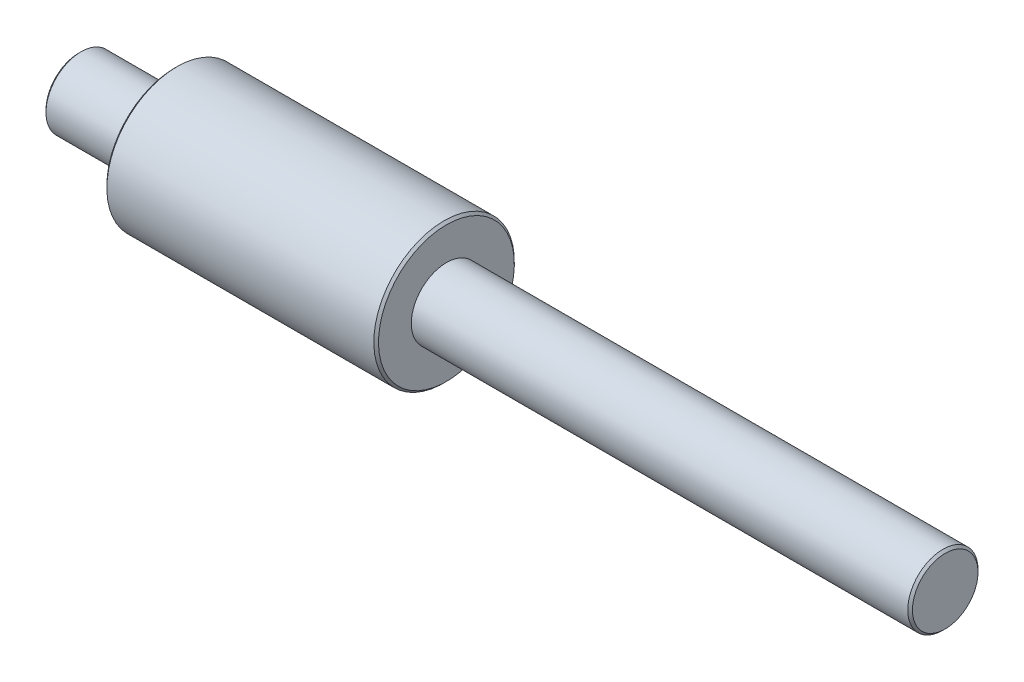
ISO-10303-21;
HEADER;
FILE_DESCRIPTION(('STEP AP214'),'2;1');
FILE_NAME('part.step','',(''),(''),'','','');
FILE_SCHEMA(('AUTOMOTIVE_DESIGN { 1 0 10303 214 1 1 1 1 }'));
ENDSEC;
DATA;
#1=APPLICATION_CONTEXT('core data for automotive mechanical design processes');
#2=APPLICATION_PROTOCOL_DEFINITION('international standard','automotive_design',2000,#1);
#3=PRODUCT_CONTEXT('',#1,'mechanical');
#4=PRODUCT('Part','Part','',(#3));
#5=PRODUCT_RELATED_PRODUCT_CATEGORY('part','',(#4));
#6=PRODUCT_DEFINITION_FORMATION('','',#4);
#7=PRODUCT_DEFINITION_CONTEXT('part definition',#1,'design');
#8=PRODUCT_DEFINITION('design','',#6,#7);
#9=PRODUCT_DEFINITION_SHAPE('','',#8);
#10=(LENGTH_UNIT() NAMED_UNIT(*) SI_UNIT(.MILLI.,.METRE.));
#11=(NAMED_UNIT(*) PLANE_ANGLE_UNIT() SI_UNIT($,.RADIAN.));
#12=(NAMED_UNIT(*) SI_UNIT($,.STERADIAN.) SOLID_ANGLE_UNIT());
#13=UNCERTAINTY_MEASURE_WITH_UNIT(LENGTH_MEASURE(1.E-05),#10,'distance_accuracy_value','');
#14=(GEOMETRIC_REPRESENTATION_CONTEXT(3) GLOBAL_UNCERTAINTY_ASSIGNED_CONTEXT((#13)) GLOBAL_UNIT_ASSIGNED_CONTEXT((#10,
#11,#12)) REPRESENTATION_CONTEXT('',''));
#15=CARTESIAN_POINT('',(0.,0.,0.));
#16=DIRECTION('',(0.,0.,1.));
#17=DIRECTION('',(1.,0.,0.));
#18=AXIS2_PLACEMENT_3D('',#15,#16,#17);
#19=CARTESIAN_POINT('',(22.25,-1.5,0.));
#20=DIRECTION('',(1.,0.,0.));
#21=DIRECTION('',(0.,1.,0.));
#22=AXIS2_PLACEMENT_3D('',#19,#20,#21);
#23=PLANE('',#22);
#24=CARTESIAN_POINT('',(22.25,-1.5,0.));
#25=DIRECTION('',(1.,0.,0.));
#26=DIRECTION('',(0.,1.,0.));
#27=AXIS2_PLACEMENT_3D('',#24,#25,#26);
#28=CIRCLE('',#27,1.40000000000001);
#29=CARTESIAN_POINT('',(22.25,-0.0999999999999946,0.));
#30=VERTEX_POINT('',#29);
#31=EDGE_CURVE('E44',#30,#30,#28,.T.);
#32=ORIENTED_EDGE('',*,*,#31,.T.);
#33=EDGE_LOOP('',(#32));
#34=FACE_BOUND('',#33,.T.);
#35=ADVANCED_FACE('F36',(#34),#23,.T.);
#36=CARTESIAN_POINT('',(-10.65,-1.5,0.));
#37=DIRECTION('',(1.,0.,0.));
#38=DIRECTION('',(0.,1.,0.));
#39=AXIS2_PLACEMENT_3D('',#36,#37,#38);
#40=CYLINDRICAL_SURFACE('',#39,1.5);
#41=CARTESIAN_POINT('',(22.15,-1.5,0.));
#42=DIRECTION('',(1.,0.,0.));
#43=DIRECTION('',(0.,0.,-1.));
#44=AXIS2_PLACEMENT_3D('',#41,#42,#43);
#45=CIRCLE('',#44,1.5);
#46=CARTESIAN_POINT('',(22.15,-1.5,-1.5));
#47=VERTEX_POINT('',#46);
#48=EDGE_CURVE('E10',#47,#47,#45,.F.);
#49=ORIENTED_EDGE('',*,*,#48,.T.);
#50=EDGE_LOOP('',(#49));
#51=FACE_BOUND('',#50,.T.);
#52=CARTESIAN_POINT('',(0.950000000000003,-1.5,0.));
#53=DIRECTION('',(1.,0.,0.));
#54=DIRECTION('',(0.,1.,0.));
#55=AXIS2_PLACEMENT_3D('',#52,#53,#54);
#56=CIRCLE('',#55,1.5);
#57=CARTESIAN_POINT('',(0.950000000000003,0.,0.));
#58=VERTEX_POINT('',#57);
#59=EDGE_CURVE('E69',#58,#58,#56,.T.);
#60=ORIENTED_EDGE('',*,*,#59,.T.);
#61=EDGE_LOOP('',(#60));
#62=FACE_BOUND('',#61,.T.);
#63=ADVANCED_FACE('F94',(#51,#62),#40,.T.);
#64=CARTESIAN_POINT('',(0.950000000000003,1.5,0.));
#65=DIRECTION('',(1.,0.,0.));
#66=DIRECTION('',(0.,1.,0.));
#67=AXIS2_PLACEMENT_3D('',#64,#65,#66);
#68=PLANE('',#67);
#69=CARTESIAN_POINT('',(0.950000000000003,-1.5,0.));
#70=DIRECTION('',(1.,0.,0.));
#71=DIRECTION('',(0.,1.,0.));
#72=AXIS2_PLACEMENT_3D('',#69,#70,#71);
#73=CIRCLE('',#72,2.89999999999999);
#74=CARTESIAN_POINT('',(0.950000000000003,1.39999999999999,0.));
#75=VERTEX_POINT('',#74);
#76=EDGE_CURVE('E52',#75,#75,#73,.T.);
#77=ORIENTED_EDGE('',*,*,#76,.T.);
#78=EDGE_LOOP('',(#77));
#79=FACE_BOUND('',#78,.T.);
#80=ORIENTED_EDGE('',*,*,#59,.F.);
#81=EDGE_LOOP('',(#80));
#82=FACE_BOUND('',#81,.T.);
#83=ADVANCED_FACE('F99',(#79,#82),#68,.T.);
#84=CARTESIAN_POINT('',(-10.65,-1.5,0.));
#85=DIRECTION('',(1.,0.,0.));
#86=DIRECTION('',(0.,1.,0.));
#87=AXIS2_PLACEMENT_3D('',#84,#85,#86);
#88=CYLINDRICAL_SURFACE('',#87,3.);
#89=CARTESIAN_POINT('',(0.849999999999995,-1.5,0.));
#90=DIRECTION('',(1.,0.,0.));
#91=DIRECTION('',(0.,0.,-1.));
#92=AXIS2_PLACEMENT_3D('',#89,#90,#91);
#93=CIRCLE('',#92,3.);
#94=CARTESIAN_POINT('',(0.849999999999993,1.5,0.));
#95=VERTEX_POINT('',#94);
#96=EDGE_CURVE('E48',#95,#95,#93,.F.);
#97=CARTESIAN_POINT('',(-10.55,-1.5,0.));
#98=DIRECTION('',(-1.,0.,0.));
#99=DIRECTION('',(0.,0.,1.));
#100=AXIS2_PLACEMENT_3D('',#97,#98,#99);
#101=CIRCLE('',#100,3.);
#102=CARTESIAN_POINT('',(-10.55,1.5,0.));
#103=VERTEX_POINT('',#102);
#104=EDGE_CURVE('E60',#103,#103,#101,.F.);
#105=CARTESIAN_POINT('',(0.849999999999993,1.5,0.));
#106=CARTESIAN_POINT('',(0.731249999999993,1.5,0.));
#107=CARTESIAN_POINT('',(0.612499999999994,1.5,0.));
#108=CARTESIAN_POINT('',(0.374999999999994,1.5,0.));
#109=CARTESIAN_POINT('',(0.256249999999994,1.5,0.));
#110=CARTESIAN_POINT('',(0.0187499999999933,1.5,0.));
#111=CARTESIAN_POINT('',(-0.100000000000007,1.5,0.));
#112=CARTESIAN_POINT('',(-0.337500000000007,1.5,0.));
#113=CARTESIAN_POINT('',(-0.456250000000006,1.5,0.));
#114=CARTESIAN_POINT('',(-0.693750000000006,1.5,0.));
#115=CARTESIAN_POINT('',(-0.812500000000005,1.5,0.));
#116=CARTESIAN_POINT('',(-1.05000000000001,1.5,0.));
#117=CARTESIAN_POINT('',(-1.16875000000001,1.5,0.));
#118=CARTESIAN_POINT('',(-1.40625000000001,1.5,0.));
#119=CARTESIAN_POINT('',(-1.52500000000001,1.5,0.));
#120=CARTESIAN_POINT('',(-1.76250000000001,1.5,0.));
#121=CARTESIAN_POINT('',(-1.88125000000001,1.5,0.));
#122=CARTESIAN_POINT('',(-2.11875,1.5,0.));
#123=CARTESIAN_POINT('',(-2.2375,1.5,0.));
#124=CARTESIAN_POINT('',(-2.475,1.5,0.));
#125=CARTESIAN_POINT('',(-2.59375,1.5,0.));
#126=CARTESIAN_POINT('',(-2.83125,1.5,0.));
#127=CARTESIAN_POINT('',(-2.95,1.5,0.));
#128=CARTESIAN_POINT('',(-3.1875,1.5,0.));
#129=CARTESIAN_POINT('',(-3.30625,1.5,0.));
#130=CARTESIAN_POINT('',(-3.54375,1.5,0.));
#131=CARTESIAN_POINT('',(-3.6625,1.5,0.));
#132=CARTESIAN_POINT('',(-3.9,1.5,0.));
#133=CARTESIAN_POINT('',(-4.01875,1.5,0.));
#134=CARTESIAN_POINT('',(-4.25625,1.5,0.));
#135=CARTESIAN_POINT('',(-4.375,1.5,0.));
#136=CARTESIAN_POINT('',(-4.6125,1.5,0.));
#137=CARTESIAN_POINT('',(-4.73125,1.5,0.));
#138=CARTESIAN_POINT('',(-4.96875,1.5,0.));
#139=CARTESIAN_POINT('',(-5.0875,1.5,0.));
#140=CARTESIAN_POINT('',(-5.325,1.5,0.));
#141=CARTESIAN_POINT('',(-5.44375,1.5,0.));
#142=CARTESIAN_POINT('',(-5.68125,1.5,0.));
#143=CARTESIAN_POINT('',(-5.8,1.5,0.));
#144=CARTESIAN_POINT('',(-6.0375,1.5,0.));
#145=CARTESIAN_POINT('',(-6.15625,1.5,0.));
#146=CARTESIAN_POINT('',(-6.39375,1.5,0.));
#147=CARTESIAN_POINT('',(-6.5125,1.5,0.));
#148=CARTESIAN_POINT('',(-6.75,1.5,0.));
#149=CARTESIAN_POINT('',(-6.86875,1.5,0.));
#150=CARTESIAN_POINT('',(-7.10625,1.5,0.));
#151=CARTESIAN_POINT('',(-7.225,1.5,0.));
#152=CARTESIAN_POINT('',(-7.4625,1.5,0.));
#153=CARTESIAN_POINT('',(-7.58125,1.5,0.));
#154=CARTESIAN_POINT('',(-7.81875,1.5,0.));
#155=CARTESIAN_POINT('',(-7.9375,1.5,0.));
#156=CARTESIAN_POINT('',(-8.175,1.5,0.));
#157=CARTESIAN_POINT('',(-8.29375,1.5,0.));
#158=CARTESIAN_POINT('',(-8.53125,1.5,0.));
#159=CARTESIAN_POINT('',(-8.65,1.5,0.));
#160=CARTESIAN_POINT('',(-8.8875,1.5,0.));
#161=CARTESIAN_POINT('',(-9.00625,1.5,0.));
#162=CARTESIAN_POINT('',(-9.24375,1.5,0.));
#163=CARTESIAN_POINT('',(-9.3625,1.5,0.));
#164=CARTESIAN_POINT('',(-9.6,1.5,0.));
#165=CARTESIAN_POINT('',(-9.71875,1.5,0.));
#166=CARTESIAN_POINT('',(-9.95625,1.5,0.));
#167=CARTESIAN_POINT('',(-10.075,1.5,0.));
#168=CARTESIAN_POINT('',(-10.3125,1.5,0.));
#169=CARTESIAN_POINT('',(-10.43125,1.5,0.));
#170=CARTESIAN_POINT('',(-10.55,1.5,0.));
#171=B_SPLINE_CURVE_WITH_KNOTS('',3,(#105,#106,#107,#108,#109,#110,#111,#112,#113,#114,#115,
#116,#117,#118,#119,#120,#121,#122,#123,#124,#125,#126,#127,#128,#129,#130,#131,#132,#133,#134,
#135,#136,#137,#138,#139,#140,#141,#142,#143,#144,#145,#146,#147,#148,#149,#150,#151,#152,#153,
#154,#155,#156,#157,#158,#159,#160,#161,#162,#163,#164,#165,#166,#167,#168,#169,#170),
.UNSPECIFIED.,.F.,.F.,(4,2,2,2,2,2,2,2,2,2,2,2,2,2,2,2,2,2,2,2,2,2,2,2,2,2,2,2,2,2,2,2,4),(0.,
0.356249999999999,0.7125,1.06875,1.425,1.78125,2.1375,2.49375,2.85,3.20625,3.5625,3.91875,4.275,
4.63125,4.9875,5.34375,5.7,6.05625,6.4125,6.76875,7.125,7.48125,7.8375,8.19375,8.55,
8.90624999999999,9.26249999999999,9.61875,9.97499999999999,10.33125,10.6875,11.04375,11.4),.UNSPECIFIED.);
#172=EDGE_CURVE('BSEAM90',#95,#103,#171,.T.);
#173=ORIENTED_EDGE('',*,*,#96,.T.);
#174=ORIENTED_EDGE('',*,*,#104,.T.);
#175=ORIENTED_EDGE('',*,*,#172,.T.);
#176=ORIENTED_EDGE('',*,*,#172,.F.);
#177=EDGE_LOOP('',(#173,#175,#174,#176));
#178=FACE_BOUND('',#177,.T.);
#179=ADVANCED_FACE('F90',(#178),#88,.T.);
#180=CARTESIAN_POINT('',(-10.65,1.5,0.));
#181=DIRECTION('',(-1.,0.,0.));
#182=DIRECTION('',(0.,-1.,0.));
#183=AXIS2_PLACEMENT_3D('',#180,#181,#182);
#184=PLANE('',#183);
#185=CARTESIAN_POINT('',(-10.65,-1.5,0.));
#186=DIRECTION('',(-1.,0.,0.));
#187=DIRECTION('',(0.,-1.,0.));
#188=AXIS2_PLACEMENT_3D('',#185,#186,#187);
#189=CIRCLE('',#188,2.90000000000001);
#190=CARTESIAN_POINT('',(-10.65,-4.40000000000001,0.));
#191=VERTEX_POINT('',#190);
#192=EDGE_CURVE('E57',#191,#191,#189,.T.);
#193=ORIENTED_EDGE('',*,*,#192,.T.);
#194=EDGE_LOOP('',(#193));
#195=FACE_BOUND('',#194,.T.);
#196=CARTESIAN_POINT('',(-10.65,-1.5,0.));
#197=DIRECTION('',(1.,0.,0.));
#198=DIRECTION('',(0.,1.,0.));
#199=AXIS2_PLACEMENT_3D('',#196,#197,#198);
#200=CIRCLE('',#199,1.5);
#201=CARTESIAN_POINT('',(-10.65,0.,0.));
#202=VERTEX_POINT('',#201);
#203=EDGE_CURVE('E72',#202,#202,#200,.T.);
#204=ORIENTED_EDGE('',*,*,#203,.T.);
#205=EDGE_LOOP('',(#204));
#206=FACE_BOUND('',#205,.T.);
#207=ADVANCED_FACE('F76',(#195,#206),#184,.T.);
#208=CARTESIAN_POINT('',(-10.65,-1.5,0.));
#209=DIRECTION('',(1.,0.,0.));
#210=DIRECTION('',(0.,1.,0.));
#211=AXIS2_PLACEMENT_3D('',#208,#209,#210);
#212=CYLINDRICAL_SURFACE('',#211,1.5);
#213=CARTESIAN_POINT('',(-14.65,-1.5,0.));
#214=DIRECTION('',(-1.,0.,0.));
#215=DIRECTION('',(0.,0.,1.));
#216=AXIS2_PLACEMENT_3D('',#213,#214,#215);
#217=CIRCLE('',#216,1.5);
#218=CARTESIAN_POINT('',(-14.65,-1.5,-1.5));
#219=VERTEX_POINT('',#218);
#220=EDGE_CURVE('E66',#219,#219,#217,.F.);
#221=ORIENTED_EDGE('',*,*,#220,.T.);
#222=EDGE_LOOP('',(#221));
#223=FACE_BOUND('',#222,.T.);
#224=ORIENTED_EDGE('',*,*,#203,.F.);
#225=EDGE_LOOP('',(#224));
#226=FACE_BOUND('',#225,.T.);
#227=ADVANCED_FACE('F78',(#223,#226),#212,.T.);
#228=CARTESIAN_POINT('',(-14.75,-1.5,0.));
#229=DIRECTION('',(-1.,0.,0.));
#230=DIRECTION('',(0.,-1.,0.));
#231=AXIS2_PLACEMENT_3D('',#228,#229,#230);
#232=PLANE('',#231);
#233=CARTESIAN_POINT('',(-14.75,-1.5,0.));
#234=DIRECTION('',(-1.,0.,0.));
#235=DIRECTION('',(0.,-1.,0.));
#236=AXIS2_PLACEMENT_3D('',#233,#234,#235);
#237=CIRCLE('',#236,1.40000000000001);
#238=CARTESIAN_POINT('',(-14.75,-1.5,-1.40000000000001));
#239=VERTEX_POINT('',#238);
#240=EDGE_CURVE('E63',#239,#239,#237,.T.);
#241=ORIENTED_EDGE('',*,*,#240,.T.);
#242=EDGE_LOOP('',(#241));
#243=FACE_BOUND('',#242,.T.);
#244=ADVANCED_FACE('F80',(#243),#232,.T.);
#245=CARTESIAN_POINT('',(-14.65,-1.5,0.));
#246=DIRECTION('',(1.,0.,0.));
#247=DIRECTION('',(0.,0.,-1.));
#248=AXIS2_PLACEMENT_3D('',#245,#246,#247);
#249=CONICAL_SURFACE('',#248,1.5,0.785398163397439);
#250=CARTESIAN_POINT('',(-14.75,-1.5,-1.40000000000001));
#251=CARTESIAN_POINT('',(-14.7489583333333,-1.5,-1.40104166666668));
#252=CARTESIAN_POINT('',(-14.7479166666667,-1.5,-1.40208333333334));
#253=CARTESIAN_POINT('',(-14.7458333333333,-1.5,-1.40416666666668));
#254=CARTESIAN_POINT('',(-14.7447916666667,-1.5,-1.40520833333334));
#255=CARTESIAN_POINT('',(-14.7427083333333,-1.5,-1.40729166666668));
#256=CARTESIAN_POINT('',(-14.7416666666667,-1.5,-1.40833333333334));
#257=CARTESIAN_POINT('',(-14.7395833333333,-1.5,-1.41041666666668));
#258=CARTESIAN_POINT('',(-14.7385416666667,-1.5,-1.41145833333334));
#259=CARTESIAN_POINT('',(-14.7364583333333,-1.5,-1.41354166666668));
#260=CARTESIAN_POINT('',(-14.7354166666667,-1.5,-1.41458333333334));
#261=CARTESIAN_POINT('',(-14.7333333333333,-1.5,-1.41666666666668));
#262=CARTESIAN_POINT('',(-14.7322916666667,-1.5,-1.41770833333334));
#263=CARTESIAN_POINT('',(-14.7302083333333,-1.5,-1.41979166666668));
#264=CARTESIAN_POINT('',(-14.7291666666667,-1.5,-1.42083333333334));
#265=CARTESIAN_POINT('',(-14.7270833333333,-1.5,-1.42291666666667));
#266=CARTESIAN_POINT('',(-14.7260416666667,-1.5,-1.42395833333334));
#267=CARTESIAN_POINT('',(-14.7239583333333,-1.5,-1.42604166666667));
#268=CARTESIAN_POINT('',(-14.7229166666667,-1.5,-1.42708333333334));
#269=CARTESIAN_POINT('',(-14.7208333333333,-1.5,-1.42916666666667));
#270=CARTESIAN_POINT('',(-14.7197916666667,-1.5,-1.43020833333334));
#271=CARTESIAN_POINT('',(-14.7177083333333,-1.5,-1.43229166666667));
#272=CARTESIAN_POINT('',(-14.7166666666667,-1.5,-1.43333333333334));
#273=CARTESIAN_POINT('',(-14.7145833333333,-1.5,-1.43541666666667));
#274=CARTESIAN_POINT('',(-14.7135416666667,-1.5,-1.43645833333334));
#275=CARTESIAN_POINT('',(-14.7114583333333,-1.5,-1.43854166666667));
#276=CARTESIAN_POINT('',(-14.7104166666667,-1.5,-1.43958333333334));
#277=CARTESIAN_POINT('',(-14.7083333333333,-1.5,-1.44166666666667));
#278=CARTESIAN_POINT('',(-14.7072916666667,-1.5,-1.44270833333334));
#279=CARTESIAN_POINT('',(-14.7052083333333,-1.5,-1.44479166666667));
#280=CARTESIAN_POINT('',(-14.7041666666667,-1.5,-1.44583333333334));
#281=CARTESIAN_POINT('',(-14.7020833333333,-1.5,-1.44791666666667));
#282=CARTESIAN_POINT('',(-14.7010416666667,-1.5,-1.44895833333334));
#283=CARTESIAN_POINT('',(-14.6989583333333,-1.5,-1.45104166666667));
#284=CARTESIAN_POINT('',(-14.6979166666667,-1.5,-1.45208333333334));
#285=CARTESIAN_POINT('',(-14.6958333333333,-1.5,-1.45416666666667));
#286=CARTESIAN_POINT('',(-14.6947916666667,-1.5,-1.45520833333334));
#287=CARTESIAN_POINT('',(-14.6927083333333,-1.5,-1.45729166666667));
#288=CARTESIAN_POINT('',(-14.6916666666667,-1.5,-1.45833333333334));
#289=CARTESIAN_POINT('',(-14.6895833333333,-1.5,-1.46041666666667));
#290=CARTESIAN_POINT('',(-14.6885416666667,-1.5,-1.46145833333334));
#291=CARTESIAN_POINT('',(-14.6864583333333,-1.5,-1.46354166666667));
#292=CARTESIAN_POINT('',(-14.6854166666667,-1.5,-1.46458333333334));
#293=CARTESIAN_POINT('',(-14.6833333333333,-1.5,-1.46666666666667));
#294=CARTESIAN_POINT('',(-14.6822916666667,-1.5,-1.46770833333334));
#295=CARTESIAN_POINT('',(-14.6802083333333,-1.5,-1.46979166666667));
#296=CARTESIAN_POINT('',(-14.6791666666667,-1.5,-1.47083333333334));
#297=CARTESIAN_POINT('',(-14.6770833333333,-1.5,-1.47291666666667));
#298=CARTESIAN_POINT('',(-14.6760416666667,-1.5,-1.47395833333334));
#299=CARTESIAN_POINT('',(-14.6739583333333,-1.5,-1.47604166666667));
#300=CARTESIAN_POINT('',(-14.6729166666667,-1.5,-1.47708333333334));
#301=CARTESIAN_POINT('',(-14.6708333333333,-1.5,-1.47916666666667));
#302=CARTESIAN_POINT('',(-14.6697916666667,-1.5,-1.48020833333334));
#303=CARTESIAN_POINT('',(-14.6677083333333,-1.5,-1.48229166666667));
#304=CARTESIAN_POINT('',(-14.6666666666667,-1.5,-1.48333333333334));
#305=CARTESIAN_POINT('',(-14.6645833333333,-1.5,-1.48541666666667));
#306=CARTESIAN_POINT('',(-14.6635416666667,-1.5,-1.48645833333334));
#307=CARTESIAN_POINT('',(-14.6614583333333,-1.5,-1.48854166666667));
#308=CARTESIAN_POINT('',(-14.6604166666667,-1.5,-1.48958333333334));
#309=CARTESIAN_POINT('',(-14.6583333333333,-1.5,-1.49166666666667));
#310=CARTESIAN_POINT('',(-14.6572916666667,-1.5,-1.49270833333334));
#311=CARTESIAN_POINT('',(-14.6552083333333,-1.5,-1.49479166666667));
#312=CARTESIAN_POINT('',(-14.6541666666667,-1.5,-1.49583333333334));
#313=CARTESIAN_POINT('',(-14.6520833333333,-1.5,-1.49791666666667));
#314=CARTESIAN_POINT('',(-14.6510416666667,-1.5,-1.49895833333334));
#315=CARTESIAN_POINT('',(-14.65,-1.5,-1.5));
#316=B_SPLINE_CURVE_WITH_KNOTS('',3,(#250,#251,#252,#253,#254,#255,#256,#257,#258,#259,#260,
#261,#262,#263,#264,#265,#266,#267,#268,#269,#270,#271,#272,#273,#274,#275,#276,#277,#278,#279,
#280,#281,#282,#283,#284,#285,#286,#287,#288,#289,#290,#291,#292,#293,#294,#295,#296,#297,#298,
#299,#300,#301,#302,#303,#304,#305,#306,#307,#308,#309,#310,#311,#312,#313,#314,#315),
.UNSPECIFIED.,.F.,.F.,(4,2,2,2,2,2,2,2,2,2,2,2,2,2,2,2,2,2,2,2,2,2,2,2,2,2,2,2,2,2,2,2,4),(0.,
0.00441941738241559,0.00883883476483102,0.0132582521472465,0.017677669529662,0.0220970869120775,
0.0265165042944931,0.0309359216769085,0.0353553390593241,0.0397747564417395,0.0441941738241551,
0.0486135912065718,0.0530330085889874,0.0574524259714028,0.0618718433538184,0.0662912607362338,
0.0707106781186494,0.0751300955010649,0.0795495128834803,0.0839689302658959,0.0883883476483113,
0.0928077650307269,0.0972271824131436,0.101646599795559,0.106066017177975,0.11048543456039,
0.114904851942806,0.119324269325221,0.123743686707637,0.128163104090052,0.132582521472468,
0.137001938854883,0.141421356237299),.UNSPECIFIED.);
#317=EDGE_CURVE('BSEAM87',#239,#219,#316,.T.);
#318=ORIENTED_EDGE('',*,*,#240,.F.);
#319=ORIENTED_EDGE('',*,*,#220,.F.);
#320=ORIENTED_EDGE('',*,*,#317,.T.);
#321=ORIENTED_EDGE('',*,*,#317,.F.);
#322=EDGE_LOOP('',(#318,#320,#319,#321));
#323=FACE_BOUND('',#322,.T.);
#324=ADVANCED_FACE('F87',(#323),#249,.T.);
#325=CARTESIAN_POINT('',(-10.55,-1.5,0.));
#326=DIRECTION('',(1.,0.,0.));
#327=DIRECTION('',(0.,0.,-1.));
#328=AXIS2_PLACEMENT_3D('',#325,#326,#327);
#329=CONICAL_SURFACE('',#328,3.,0.785398163397448);
#330=ORIENTED_EDGE('',*,*,#192,.F.);
#331=EDGE_LOOP('',(#330));
#332=FACE_BOUND('',#331,.T.);
#333=ORIENTED_EDGE('',*,*,#104,.F.);
#334=EDGE_LOOP('',(#333));
#335=FACE_BOUND('',#334,.T.);
#336=ADVANCED_FACE('F109',(#332,#335),#329,.T.);
#337=CARTESIAN_POINT('',(0.950000000000003,-1.5,0.));
#338=DIRECTION('',(-1.,0.,0.));
#339=DIRECTION('',(0.,0.,1.));
#340=AXIS2_PLACEMENT_3D('',#337,#338,#339);
#341=CONICAL_SURFACE('',#340,2.89999999999999,0.78539816339745);
#342=ORIENTED_EDGE('',*,*,#96,.F.);
#343=EDGE_LOOP('',(#342));
#344=FACE_BOUND('',#343,.T.);
#345=ORIENTED_EDGE('',*,*,#76,.F.);
#346=EDGE_LOOP('',(#345));
#347=FACE_BOUND('',#346,.T.);
#348=ADVANCED_FACE('F115',(#344,#347),#341,.T.);
#349=CARTESIAN_POINT('',(22.25,-1.5,0.));
#350=DIRECTION('',(-1.,0.,0.));
#351=DIRECTION('',(0.,0.,1.));
#352=AXIS2_PLACEMENT_3D('',#349,#350,#351);
#353=CONICAL_SURFACE('',#352,1.4,0.785398163397427);
#354=ORIENTED_EDGE('',*,*,#48,.F.);
#355=EDGE_LOOP('',(#354));
#356=FACE_BOUND('',#355,.T.);
#357=ORIENTED_EDGE('',*,*,#31,.F.);
#358=EDGE_LOOP('',(#357));
#359=FACE_BOUND('',#358,.T.);
#360=ADVANCED_FACE('F39',(#356,#359),#353,.T.);
#361=CLOSED_SHELL('',(#35,#63,#83,#179,#207,#227,#244,#324,#336,#348,#360));
#362=MANIFOLD_SOLID_BREP('B2',#361);
#363=ADVANCED_BREP_SHAPE_REPRESENTATION('',(#18,#362),#14);
#364=SHAPE_DEFINITION_REPRESENTATION(#9,#363);
ENDSEC;
END-ISO-10303-21;
